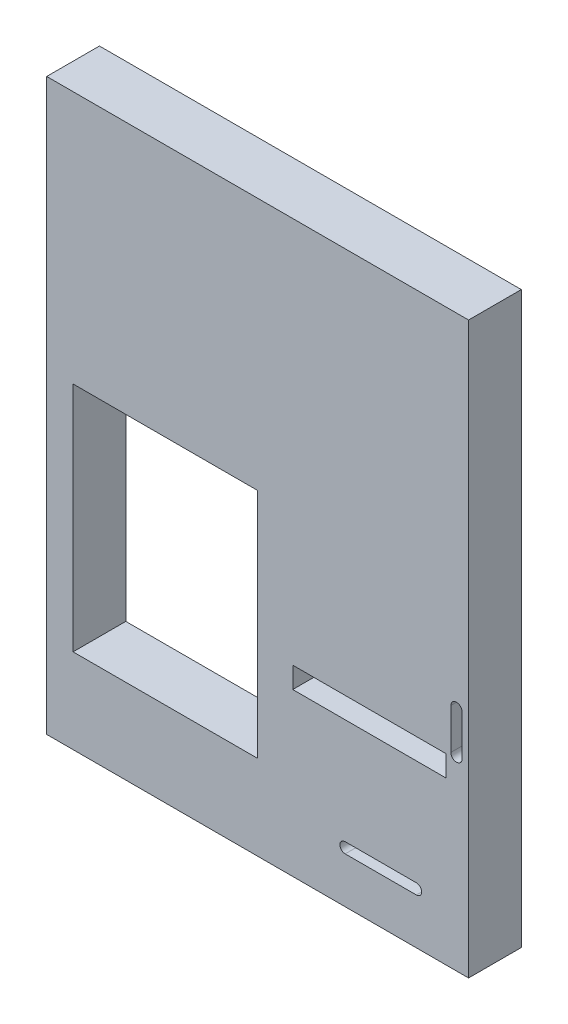
ISO-10303-21;
HEADER;
FILE_DESCRIPTION(('STEP AP214'),'2;1');
FILE_NAME('part.step','',(''),(''),'','','');
FILE_SCHEMA(('AUTOMOTIVE_DESIGN { 1 0 10303 214 1 1 1 1 }'));
ENDSEC;
DATA;
#1=APPLICATION_CONTEXT('core data for automotive mechanical design processes');
#2=APPLICATION_PROTOCOL_DEFINITION('international standard','automotive_design',2000,#1);
#3=PRODUCT_CONTEXT('',#1,'mechanical');
#4=PRODUCT('Part','Part','',(#3));
#5=PRODUCT_RELATED_PRODUCT_CATEGORY('part','',(#4));
#6=PRODUCT_DEFINITION_FORMATION('','',#4);
#7=PRODUCT_DEFINITION_CONTEXT('part definition',#1,'design');
#8=PRODUCT_DEFINITION('design','',#6,#7);
#9=PRODUCT_DEFINITION_SHAPE('','',#8);
#10=(LENGTH_UNIT() NAMED_UNIT(*) SI_UNIT(.MILLI.,.METRE.));
#11=(NAMED_UNIT(*) PLANE_ANGLE_UNIT() SI_UNIT($,.RADIAN.));
#12=(NAMED_UNIT(*) SI_UNIT($,.STERADIAN.) SOLID_ANGLE_UNIT());
#13=UNCERTAINTY_MEASURE_WITH_UNIT(LENGTH_MEASURE(1.E-05),#10,'distance_accuracy_value','');
#14=(GEOMETRIC_REPRESENTATION_CONTEXT(3) GLOBAL_UNCERTAINTY_ASSIGNED_CONTEXT((#13)) GLOBAL_UNIT_ASSIGNED_CONTEXT((#10,
#11,#12)) REPRESENTATION_CONTEXT('',''));
#15=CARTESIAN_POINT('',(0.,0.,0.));
#16=DIRECTION('',(0.,0.,1.));
#17=DIRECTION('',(1.,0.,0.));
#18=AXIS2_PLACEMENT_3D('',#15,#16,#17);
#19=CARTESIAN_POINT('',(100.,120.,25.));
#20=DIRECTION('',(0.,-1.,0.));
#21=DIRECTION('',(1.,0.,0.));
#22=AXIS2_PLACEMENT_3D('',#19,#20,#21);
#23=PLANE('',#22);
#24=DIRECTION('',(-1.,0.,0.));
#25=VECTOR('',#24,1.);
#26=CARTESIAN_POINT('',(100.,120.,0.));
#27=LINE('',#26,#25);
#28=CARTESIAN_POINT('',(100.,120.,0.));
#29=VERTEX_POINT('',#28);
#30=CARTESIAN_POINT('',(-100.,120.,0.));
#31=VERTEX_POINT('',#30);
#32=EDGE_CURVE('E290',#29,#31,#27,.T.);
#33=ORIENTED_EDGE('',*,*,#32,.T.);
#34=DIRECTION('',(0.,0.,-1.));
#35=VECTOR('',#34,1.);
#36=CARTESIAN_POINT('',(-100.,120.,25.));
#37=LINE('',#36,#35);
#38=CARTESIAN_POINT('',(-100.,120.,25.));
#39=VERTEX_POINT('',#38);
#40=EDGE_CURVE('E12',#39,#31,#37,.T.);
#41=ORIENTED_EDGE('',*,*,#40,.F.);
#42=DIRECTION('',(-1.,0.,0.));
#43=VECTOR('',#42,1.);
#44=CARTESIAN_POINT('',(100.,120.,25.));
#45=LINE('',#44,#43);
#46=CARTESIAN_POINT('',(100.,120.,25.));
#47=VERTEX_POINT('',#46);
#48=EDGE_CURVE('E305',#47,#39,#45,.T.);
#49=ORIENTED_EDGE('',*,*,#48,.F.);
#50=DIRECTION('',(0.,0.,-1.));
#51=VECTOR('',#50,1.);
#52=CARTESIAN_POINT('',(100.,120.,25.));
#53=LINE('',#52,#51);
#54=EDGE_CURVE('E56',#47,#29,#53,.T.);
#55=ORIENTED_EDGE('',*,*,#54,.T.);
#56=EDGE_LOOP('',(#33,#41,#49,#55));
#57=FACE_BOUND('',#56,.T.);
#58=ADVANCED_FACE('F48',(#57),#23,.F.);
#59=CARTESIAN_POINT('',(-100.,-120.,25.));
#60=DIRECTION('',(-1.,0.,0.));
#61=DIRECTION('',(0.,0.,1.));
#62=AXIS2_PLACEMENT_3D('',#59,#60,#61);
#63=PLANE('',#62);
#64=DIRECTION('',(0.,1.,0.));
#65=VECTOR('',#64,1.);
#66=CARTESIAN_POINT('',(-100.,-120.,0.));
#67=LINE('',#66,#65);
#68=CARTESIAN_POINT('',(-100.,-150.164162566349,0.));
#69=VERTEX_POINT('',#68);
#70=EDGE_CURVE('E295',#69,#31,#67,.T.);
#71=ORIENTED_EDGE('',*,*,#70,.F.);
#72=DIRECTION('',(0.,0.,1.));
#73=VECTOR('',#72,1.);
#74=CARTESIAN_POINT('',(-100.,-150.164162566349,0.));
#75=LINE('',#74,#73);
#76=CARTESIAN_POINT('',(-100.,-150.164162566349,25.));
#77=VERTEX_POINT('',#76);
#78=EDGE_CURVE('E271',#69,#77,#75,.T.);
#79=ORIENTED_EDGE('',*,*,#78,.T.);
#80=DIRECTION('',(0.,1.,0.));
#81=VECTOR('',#80,1.);
#82=CARTESIAN_POINT('',(-100.,-120.,25.));
#83=LINE('',#82,#81);
#84=EDGE_CURVE('E313',#77,#39,#83,.T.);
#85=ORIENTED_EDGE('',*,*,#84,.T.);
#86=ORIENTED_EDGE('',*,*,#40,.T.);
#87=EDGE_LOOP('',(#71,#79,#85,#86));
#88=FACE_BOUND('',#87,.T.);
#89=ADVANCED_FACE('F431',(#88),#63,.T.);
#90=CARTESIAN_POINT('',(100.,-120.,25.));
#91=DIRECTION('',(-1.,0.,0.));
#92=DIRECTION('',(0.,0.,1.));
#93=AXIS2_PLACEMENT_3D('',#90,#91,#92);
#94=PLANE('',#93);
#95=DIRECTION('',(0.,1.,0.));
#96=VECTOR('',#95,1.);
#97=CARTESIAN_POINT('',(100.,-120.,0.));
#98=LINE('',#97,#96);
#99=CARTESIAN_POINT('',(100.,-150.164162566349,0.));
#100=VERTEX_POINT('',#99);
#101=EDGE_CURVE('E302',#100,#29,#98,.T.);
#102=ORIENTED_EDGE('',*,*,#101,.T.);
#103=ORIENTED_EDGE('',*,*,#54,.F.);
#104=DIRECTION('',(0.,1.,0.));
#105=VECTOR('',#104,1.);
#106=CARTESIAN_POINT('',(100.,-120.,25.));
#107=LINE('',#106,#105);
#108=CARTESIAN_POINT('',(100.,-150.164162566349,25.));
#109=VERTEX_POINT('',#108);
#110=EDGE_CURVE('E297',#109,#47,#107,.T.);
#111=ORIENTED_EDGE('',*,*,#110,.F.);
#112=DIRECTION('',(0.,0.,1.));
#113=VECTOR('',#112,1.);
#114=CARTESIAN_POINT('',(100.,-150.164162566349,0.));
#115=LINE('',#114,#113);
#116=EDGE_CURVE('E347',#100,#109,#115,.T.);
#117=ORIENTED_EDGE('',*,*,#116,.F.);
#118=EDGE_LOOP('',(#102,#103,#111,#117));
#119=FACE_BOUND('',#118,.T.);
#120=ADVANCED_FACE('F436',(#119),#94,.F.);
#121=CARTESIAN_POINT('',(0.,0.,25.));
#122=DIRECTION('',(0.,0.,-1.));
#123=DIRECTION('',(-1.,0.,0.));
#124=AXIS2_PLACEMENT_3D('',#121,#122,#123);
#125=PLANE('',#124);
#126=DIRECTION('',(1.,0.,0.));
#127=VECTOR('',#126,1.);
#128=CARTESIAN_POINT('',(0.,-63.3939838192922,25.));
#129=LINE('',#128,#127);
#130=CARTESIAN_POINT('',(16.6490819522243,-63.3939838192922,25.));
#131=VERTEX_POINT('',#130);
#132=CARTESIAN_POINT('',(89.3674545266771,-63.3939838192922,25.));
#133=VERTEX_POINT('',#132);
#134=EDGE_CURVE('E504',#131,#133,#129,.T.);
#135=ORIENTED_EDGE('',*,*,#134,.T.);
#136=DIRECTION('',(0.,-1.,0.));
#137=VECTOR('',#136,1.);
#138=CARTESIAN_POINT('',(89.3674545266771,0.,25.));
#139=LINE('',#138,#137);
#140=CARTESIAN_POINT('',(89.3674545266771,-73.3939838192922,25.));
#141=VERTEX_POINT('',#140);
#142=EDGE_CURVE('E230',#133,#141,#139,.T.);
#143=ORIENTED_EDGE('',*,*,#142,.T.);
#144=DIRECTION('',(-1.,0.,0.));
#145=VECTOR('',#144,1.);
#146=CARTESIAN_POINT('',(0.,-73.3939838192922,25.));
#147=LINE('',#146,#145);
#148=CARTESIAN_POINT('',(16.6490819522243,-73.3939838192922,25.));
#149=VERTEX_POINT('',#148);
#150=EDGE_CURVE('E509',#141,#149,#147,.T.);
#151=ORIENTED_EDGE('',*,*,#150,.T.);
#152=DIRECTION('',(0.,1.,0.));
#153=VECTOR('',#152,1.);
#154=CARTESIAN_POINT('',(16.6490819522243,0.,25.));
#155=LINE('',#154,#153);
#156=EDGE_CURVE('E190',#149,#131,#155,.T.);
#157=ORIENTED_EDGE('',*,*,#156,.T.);
#158=EDGE_LOOP('',(#135,#143,#151,#157));
#159=FACE_BOUND('',#158,.T.);
#160=DIRECTION('',(1.,0.,0.));
#161=VECTOR('',#160,1.);
#162=CARTESIAN_POINT('',(0.,-123.445469049431,25.));
#163=LINE('',#162,#161);
#164=CARTESIAN_POINT('',(41.4919387106455,-123.445469049431,25.));
#165=VERTEX_POINT('',#164);
#166=CARTESIAN_POINT('',(75.2670888522956,-123.445469049431,25.));
#167=VERTEX_POINT('',#166);
#168=EDGE_CURVE('E545',#165,#167,#163,.T.);
#169=ORIENTED_EDGE('',*,*,#168,.T.);
#170=CARTESIAN_POINT('',(75.2670888522956,-125.945469049431,25.));
#171=DIRECTION('',(0.,0.,-1.));
#172=DIRECTION('',(-1.,0.,0.));
#173=AXIS2_PLACEMENT_3D('',#170,#171,#172);
#174=CIRCLE('',#173,2.5);
#175=CARTESIAN_POINT('',(75.2670888522956,-128.445469049431,25.));
#176=VERTEX_POINT('',#175);
#177=EDGE_CURVE('E250',#167,#176,#174,.T.);
#178=ORIENTED_EDGE('',*,*,#177,.T.);
#179=DIRECTION('',(-1.,0.,0.));
#180=VECTOR('',#179,1.);
#181=CARTESIAN_POINT('',(0.,-128.445469049431,25.));
#182=LINE('',#181,#180);
#183=CARTESIAN_POINT('',(41.4919387106455,-128.445469049431,25.));
#184=VERTEX_POINT('',#183);
#185=EDGE_CURVE('E537',#176,#184,#182,.T.);
#186=ORIENTED_EDGE('',*,*,#185,.T.);
#187=CARTESIAN_POINT('',(41.4919387106455,-125.945469049431,25.));
#188=DIRECTION('',(0.,0.,-1.));
#189=DIRECTION('',(-1.,0.,0.));
#190=AXIS2_PLACEMENT_3D('',#187,#188,#189);
#191=CIRCLE('',#190,2.5);
#192=EDGE_CURVE('E541',#184,#165,#191,.T.);
#193=ORIENTED_EDGE('',*,*,#192,.T.);
#194=EDGE_LOOP('',(#169,#178,#186,#193));
#195=FACE_BOUND('',#194,.T.);
#196=DIRECTION('',(0.,1.,0.));
#197=VECTOR('',#196,1.);
#198=CARTESIAN_POINT('',(91.5975388869168,0.,25.));
#199=LINE('',#198,#197);
#200=CARTESIAN_POINT('',(91.5975388869168,-61.7491897215178,25.));
#201=VERTEX_POINT('',#200);
#202=CARTESIAN_POINT('',(91.5975388869168,-42.4693194311734,25.));
#203=VERTEX_POINT('',#202);
#204=EDGE_CURVE('E369',#201,#203,#199,.T.);
#205=ORIENTED_EDGE('',*,*,#204,.T.);
#206=CARTESIAN_POINT('',(94.2568313407574,-42.4693194311734,25.));
#207=DIRECTION('',(0.,0.,-1.));
#208=DIRECTION('',(-1.,0.,0.));
#209=AXIS2_PLACEMENT_3D('',#206,#207,#208);
#210=CIRCLE('',#209,2.6592924538406);
#211=CARTESIAN_POINT('',(96.916123794598,-42.4693194311734,25.));
#212=VERTEX_POINT('',#211);
#213=EDGE_CURVE('E362',#203,#212,#210,.T.);
#214=ORIENTED_EDGE('',*,*,#213,.T.);
#215=DIRECTION('',(0.,-1.,0.));
#216=VECTOR('',#215,1.);
#217=CARTESIAN_POINT('',(96.916123794598,0.,25.));
#218=LINE('',#217,#216);
#219=CARTESIAN_POINT('',(96.916123794598,-61.7491897215178,25.));
#220=VERTEX_POINT('',#219);
#221=EDGE_CURVE('E377',#212,#220,#218,.T.);
#222=ORIENTED_EDGE('',*,*,#221,.T.);
#223=CARTESIAN_POINT('',(94.2568313407574,-61.7491897215178,25.));
#224=DIRECTION('',(0.,0.,-1.));
#225=DIRECTION('',(-1.,0.,0.));
#226=AXIS2_PLACEMENT_3D('',#223,#224,#225);
#227=CIRCLE('',#226,2.6592924538406);
#228=EDGE_CURVE('E373',#220,#201,#227,.T.);
#229=ORIENTED_EDGE('',*,*,#228,.T.);
#230=EDGE_LOOP('',(#205,#214,#222,#229));
#231=FACE_BOUND('',#230,.T.);
#232=DIRECTION('',(-1.,0.,0.));
#233=VECTOR('',#232,1.);
#234=CARTESIAN_POINT('',(0.,0.,25.));
#235=LINE('',#234,#233);
#236=CARTESIAN_POINT('',(0.,0.,25.));
#237=VERTEX_POINT('',#236);
#238=CARTESIAN_POINT('',(-87.5,0.,25.));
#239=VERTEX_POINT('',#238);
#240=EDGE_CURVE('E342',#237,#239,#235,.T.);
#241=ORIENTED_EDGE('',*,*,#240,.F.);
#242=DIRECTION('',(0.,1.,0.));
#243=VECTOR('',#242,1.);
#244=CARTESIAN_POINT('',(0.,0.,25.));
#245=LINE('',#244,#243);
#246=CARTESIAN_POINT('',(0.,-110.,25.));
#247=VERTEX_POINT('',#246);
#248=EDGE_CURVE('E345',#247,#237,#245,.T.);
#249=ORIENTED_EDGE('',*,*,#248,.F.);
#250=DIRECTION('',(1.,0.,0.));
#251=VECTOR('',#250,1.);
#252=CARTESIAN_POINT('',(0.,-110.,25.));
#253=LINE('',#252,#251);
#254=CARTESIAN_POINT('',(-87.5,-110.,25.));
#255=VERTEX_POINT('',#254);
#256=EDGE_CURVE('E270',#255,#247,#253,.T.);
#257=ORIENTED_EDGE('',*,*,#256,.F.);
#258=DIRECTION('',(0.,-1.,0.));
#259=VECTOR('',#258,1.);
#260=CARTESIAN_POINT('',(-87.5,0.,25.));
#261=LINE('',#260,#259);
#262=EDGE_CURVE('E338',#239,#255,#261,.T.);
#263=ORIENTED_EDGE('',*,*,#262,.F.);
#264=EDGE_LOOP('',(#241,#249,#257,#263));
#265=FACE_BOUND('',#264,.T.);
#266=ORIENTED_EDGE('',*,*,#48,.T.);
#267=ORIENTED_EDGE('',*,*,#84,.F.);
#268=DIRECTION('',(1.,0.,0.));
#269=VECTOR('',#268,1.);
#270=CARTESIAN_POINT('',(-100.,-150.164162566349,25.));
#271=LINE('',#270,#269);
#272=EDGE_CURVE('E359',#77,#109,#271,.T.);
#273=ORIENTED_EDGE('',*,*,#272,.T.);
#274=ORIENTED_EDGE('',*,*,#110,.T.);
#275=EDGE_LOOP('',(#266,#267,#273,#274));
#276=FACE_BOUND('',#275,.T.);
#277=ADVANCED_FACE('F417',(#159,#195,#231,#265,#276),#125,.F.);
#278=CARTESIAN_POINT('',(0.,0.,0.));
#279=DIRECTION('',(0.,0.,-1.));
#280=DIRECTION('',(-1.,0.,0.));
#281=AXIS2_PLACEMENT_3D('',#278,#279,#280);
#282=PLANE('',#281);
#283=DIRECTION('',(0.,-1.,0.));
#284=VECTOR('',#283,1.);
#285=CARTESIAN_POINT('',(89.3674545266771,-63.3939838192922,0.));
#286=LINE('',#285,#284);
#287=CARTESIAN_POINT('',(89.3674545266771,-63.3939838192922,0.));
#288=VERTEX_POINT('',#287);
#289=CARTESIAN_POINT('',(89.3674545266771,-73.3939838192922,0.));
#290=VERTEX_POINT('',#289);
#291=EDGE_CURVE('E71',#288,#290,#286,.T.);
#292=ORIENTED_EDGE('',*,*,#291,.F.);
#293=DIRECTION('',(1.,0.,0.));
#294=VECTOR('',#293,1.);
#295=CARTESIAN_POINT('',(89.3674545266771,-63.3939838192922,0.));
#296=LINE('',#295,#294);
#297=CARTESIAN_POINT('',(16.6490819522243,-63.3939838192922,0.));
#298=VERTEX_POINT('',#297);
#299=EDGE_CURVE('E205',#298,#288,#296,.T.);
#300=ORIENTED_EDGE('',*,*,#299,.F.);
#301=DIRECTION('',(0.,1.,0.));
#302=VECTOR('',#301,1.);
#303=CARTESIAN_POINT('',(16.6490819522243,-63.3939838192922,0.));
#304=LINE('',#303,#302);
#305=CARTESIAN_POINT('',(16.6490819522243,-73.3939838192922,0.));
#306=VERTEX_POINT('',#305);
#307=EDGE_CURVE('E187',#306,#298,#304,.T.);
#308=ORIENTED_EDGE('',*,*,#307,.F.);
#309=DIRECTION('',(-1.,0.,0.));
#310=VECTOR('',#309,1.);
#311=CARTESIAN_POINT('',(89.3674545266771,-73.3939838192922,0.));
#312=LINE('',#311,#310);
#313=EDGE_CURVE('E197',#290,#306,#312,.T.);
#314=ORIENTED_EDGE('',*,*,#313,.F.);
#315=EDGE_LOOP('',(#292,#300,#308,#314));
#316=FACE_BOUND('',#315,.T.);
#317=CARTESIAN_POINT('',(75.2670888522956,-125.945469049431,0.));
#318=DIRECTION('',(0.,0.,-1.));
#319=DIRECTION('',(-1.,0.,0.));
#320=AXIS2_PLACEMENT_3D('',#317,#318,#319);
#321=CIRCLE('',#320,2.5);
#322=CARTESIAN_POINT('',(75.2670888522956,-123.445469049431,0.));
#323=VERTEX_POINT('',#322);
#324=CARTESIAN_POINT('',(75.2670888522956,-128.445469049431,0.));
#325=VERTEX_POINT('',#324);
#326=EDGE_CURVE('E224',#323,#325,#321,.T.);
#327=ORIENTED_EDGE('',*,*,#326,.F.);
#328=DIRECTION('',(1.,0.,0.));
#329=VECTOR('',#328,1.);
#330=CARTESIAN_POINT('',(75.2670888522956,-123.445469049431,0.));
#331=LINE('',#330,#329);
#332=CARTESIAN_POINT('',(41.4919387106455,-123.445469049431,0.));
#333=VERTEX_POINT('',#332);
#334=EDGE_CURVE('E522',#333,#323,#331,.T.);
#335=ORIENTED_EDGE('',*,*,#334,.F.);
#336=CARTESIAN_POINT('',(41.4919387106455,-125.945469049431,0.));
#337=DIRECTION('',(0.,0.,-1.));
#338=DIRECTION('',(-1.,0.,0.));
#339=AXIS2_PLACEMENT_3D('',#336,#337,#338);
#340=CIRCLE('',#339,2.5);
#341=CARTESIAN_POINT('',(41.4919387106455,-128.445469049431,0.));
#342=VERTEX_POINT('',#341);
#343=EDGE_CURVE('E236',#342,#333,#340,.T.);
#344=ORIENTED_EDGE('',*,*,#343,.F.);
#345=DIRECTION('',(-1.,0.,0.));
#346=VECTOR('',#345,1.);
#347=CARTESIAN_POINT('',(75.2670888522956,-128.445469049431,0.));
#348=LINE('',#347,#346);
#349=EDGE_CURVE('E229',#325,#342,#348,.T.);
#350=ORIENTED_EDGE('',*,*,#349,.F.);
#351=EDGE_LOOP('',(#327,#335,#344,#350));
#352=FACE_BOUND('',#351,.T.);
#353=CARTESIAN_POINT('',(94.2568313407574,-42.4693194311734,0.));
#354=DIRECTION('',(0.,0.,-1.));
#355=DIRECTION('',(-1.,0.,0.));
#356=AXIS2_PLACEMENT_3D('',#353,#354,#355);
#357=CIRCLE('',#356,2.6592924538406);
#358=CARTESIAN_POINT('',(91.5975388869168,-42.4693194311734,0.));
#359=VERTEX_POINT('',#358);
#360=CARTESIAN_POINT('',(96.916123794598,-42.4693194311734,0.));
#361=VERTEX_POINT('',#360);
#362=EDGE_CURVE('E244',#359,#361,#357,.T.);
#363=ORIENTED_EDGE('',*,*,#362,.F.);
#364=DIRECTION('',(0.,1.,0.));
#365=VECTOR('',#364,1.);
#366=CARTESIAN_POINT('',(91.5975388869168,-42.4693194311734,0.));
#367=LINE('',#366,#365);
#368=CARTESIAN_POINT('',(91.5975388869168,-61.7491897215178,0.));
#369=VERTEX_POINT('',#368);
#370=EDGE_CURVE('E387',#369,#359,#367,.T.);
#371=ORIENTED_EDGE('',*,*,#370,.F.);
#372=CARTESIAN_POINT('',(94.2568313407574,-61.7491897215178,0.));
#373=DIRECTION('',(0.,0.,-1.));
#374=DIRECTION('',(-1.,0.,0.));
#375=AXIS2_PLACEMENT_3D('',#372,#373,#374);
#376=CIRCLE('',#375,2.6592924538406);
#377=CARTESIAN_POINT('',(96.916123794598,-61.7491897215178,0.));
#378=VERTEX_POINT('',#377);
#379=EDGE_CURVE('E256',#378,#369,#376,.T.);
#380=ORIENTED_EDGE('',*,*,#379,.F.);
#381=DIRECTION('',(0.,-1.,0.));
#382=VECTOR('',#381,1.);
#383=CARTESIAN_POINT('',(96.916123794598,-42.4693194311734,0.));
#384=LINE('',#383,#382);
#385=EDGE_CURVE('E249',#361,#378,#384,.T.);
#386=ORIENTED_EDGE('',*,*,#385,.F.);
#387=EDGE_LOOP('',(#363,#371,#380,#386));
#388=FACE_BOUND('',#387,.T.);
#389=DIRECTION('',(0.,1.,0.));
#390=VECTOR('',#389,1.);
#391=CARTESIAN_POINT('',(0.,0.,0.));
#392=LINE('',#391,#390);
#393=CARTESIAN_POINT('',(0.,-110.,0.));
#394=VERTEX_POINT('',#393);
#395=CARTESIAN_POINT('',(0.,0.,0.));
#396=VERTEX_POINT('',#395);
#397=EDGE_CURVE('E264',#394,#396,#392,.T.);
#398=ORIENTED_EDGE('',*,*,#397,.T.);
#399=DIRECTION('',(-1.,0.,0.));
#400=VECTOR('',#399,1.);
#401=CARTESIAN_POINT('',(0.,0.,0.));
#402=LINE('',#401,#400);
#403=CARTESIAN_POINT('',(-87.5,0.,0.));
#404=VERTEX_POINT('',#403);
#405=EDGE_CURVE('E269',#396,#404,#402,.T.);
#406=ORIENTED_EDGE('',*,*,#405,.T.);
#407=DIRECTION('',(0.,-1.,0.));
#408=VECTOR('',#407,1.);
#409=CARTESIAN_POINT('',(-87.5,0.,0.));
#410=LINE('',#409,#408);
#411=CARTESIAN_POINT('',(-87.5,-110.,0.));
#412=VERTEX_POINT('',#411);
#413=EDGE_CURVE('E277',#404,#412,#410,.T.);
#414=ORIENTED_EDGE('',*,*,#413,.T.);
#415=DIRECTION('',(1.,0.,0.));
#416=VECTOR('',#415,1.);
#417=CARTESIAN_POINT('',(0.,-110.,0.));
#418=LINE('',#417,#416);
#419=EDGE_CURVE('E282',#412,#394,#418,.T.);
#420=ORIENTED_EDGE('',*,*,#419,.T.);
#421=EDGE_LOOP('',(#398,#406,#414,#420));
#422=FACE_BOUND('',#421,.T.);
#423=ORIENTED_EDGE('',*,*,#32,.F.);
#424=ORIENTED_EDGE('',*,*,#101,.F.);
#425=DIRECTION('',(1.,0.,0.));
#426=VECTOR('',#425,1.);
#427=CARTESIAN_POINT('',(-100.,-150.164162566349,0.));
#428=LINE('',#427,#426);
#429=EDGE_CURVE('E357',#69,#100,#428,.T.);
#430=ORIENTED_EDGE('',*,*,#429,.F.);
#431=ORIENTED_EDGE('',*,*,#70,.T.);
#432=EDGE_LOOP('',(#423,#424,#430,#431));
#433=FACE_BOUND('',#432,.T.);
#434=ADVANCED_FACE('F202',(#316,#352,#388,#422,#433),#282,.T.);
#435=CARTESIAN_POINT('',(0.,0.,0.));
#436=DIRECTION('',(1.,0.,0.));
#437=DIRECTION('',(0.,1.,0.));
#438=AXIS2_PLACEMENT_3D('',#435,#436,#437);
#439=PLANE('',#438);
#440=ORIENTED_EDGE('',*,*,#248,.T.);
#441=DIRECTION('',(0.,0.,1.));
#442=VECTOR('',#441,1.);
#443=CARTESIAN_POINT('',(0.,0.,0.));
#444=LINE('',#443,#442);
#445=EDGE_CURVE('E323',#396,#237,#444,.T.);
#446=ORIENTED_EDGE('',*,*,#445,.F.);
#447=ORIENTED_EDGE('',*,*,#397,.F.);
#448=DIRECTION('',(0.,0.,1.));
#449=VECTOR('',#448,1.);
#450=CARTESIAN_POINT('',(0.,-110.,0.));
#451=LINE('',#450,#449);
#452=EDGE_CURVE('E296',#394,#247,#451,.T.);
#453=ORIENTED_EDGE('',*,*,#452,.T.);
#454=EDGE_LOOP('',(#440,#446,#447,#453));
#455=FACE_BOUND('',#454,.T.);
#456=ADVANCED_FACE('F448',(#455),#439,.F.);
#457=CARTESIAN_POINT('',(0.,-110.,0.));
#458=DIRECTION('',(0.,-1.,0.));
#459=DIRECTION('',(1.,0.,0.));
#460=AXIS2_PLACEMENT_3D('',#457,#458,#459);
#461=PLANE('',#460);
#462=ORIENTED_EDGE('',*,*,#256,.T.);
#463=ORIENTED_EDGE('',*,*,#452,.F.);
#464=ORIENTED_EDGE('',*,*,#419,.F.);
#465=DIRECTION('',(0.,0.,1.));
#466=VECTOR('',#465,1.);
#467=CARTESIAN_POINT('',(-87.5,-110.,0.));
#468=LINE('',#467,#466);
#469=EDGE_CURVE('E330',#412,#255,#468,.T.);
#470=ORIENTED_EDGE('',*,*,#469,.T.);
#471=EDGE_LOOP('',(#462,#463,#464,#470));
#472=FACE_BOUND('',#471,.T.);
#473=ADVANCED_FACE('F457',(#472),#461,.F.);
#474=CARTESIAN_POINT('',(-87.5,0.,0.));
#475=DIRECTION('',(-1.,0.,0.));
#476=DIRECTION('',(0.,-1.,0.));
#477=AXIS2_PLACEMENT_3D('',#474,#475,#476);
#478=PLANE('',#477);
#479=ORIENTED_EDGE('',*,*,#262,.T.);
#480=ORIENTED_EDGE('',*,*,#469,.F.);
#481=ORIENTED_EDGE('',*,*,#413,.F.);
#482=DIRECTION('',(0.,0.,1.));
#483=VECTOR('',#482,1.);
#484=CARTESIAN_POINT('',(-87.5,0.,0.));
#485=LINE('',#484,#483);
#486=EDGE_CURVE('E327',#404,#239,#485,.T.);
#487=ORIENTED_EDGE('',*,*,#486,.T.);
#488=EDGE_LOOP('',(#479,#480,#481,#487));
#489=FACE_BOUND('',#488,.T.);
#490=ADVANCED_FACE('F461',(#489),#478,.F.);
#491=CARTESIAN_POINT('',(0.,0.,0.));
#492=DIRECTION('',(0.,1.,0.));
#493=DIRECTION('',(-1.,0.,0.));
#494=AXIS2_PLACEMENT_3D('',#491,#492,#493);
#495=PLANE('',#494);
#496=ORIENTED_EDGE('',*,*,#240,.T.);
#497=ORIENTED_EDGE('',*,*,#486,.F.);
#498=ORIENTED_EDGE('',*,*,#405,.F.);
#499=ORIENTED_EDGE('',*,*,#445,.T.);
#500=EDGE_LOOP('',(#496,#497,#498,#499));
#501=FACE_BOUND('',#500,.T.);
#502=ADVANCED_FACE('F458',(#501),#495,.F.);
#503=CARTESIAN_POINT('',(-100.,-150.164162566349,0.));
#504=DIRECTION('',(0.,-1.,0.));
#505=DIRECTION('',(0.,0.,-1.));
#506=AXIS2_PLACEMENT_3D('',#503,#504,#505);
#507=PLANE('',#506);
#508=ORIENTED_EDGE('',*,*,#272,.F.);
#509=ORIENTED_EDGE('',*,*,#78,.F.);
#510=ORIENTED_EDGE('',*,*,#429,.T.);
#511=ORIENTED_EDGE('',*,*,#116,.T.);
#512=EDGE_LOOP('',(#508,#509,#510,#511));
#513=FACE_BOUND('',#512,.T.);
#514=ADVANCED_FACE('F427',(#513),#507,.T.);
#515=CARTESIAN_POINT('',(94.2568313407574,-42.4693194311734,40.));
#516=DIRECTION('',(0.,0.,-1.));
#517=DIRECTION('',(-1.,0.,0.));
#518=AXIS2_PLACEMENT_3D('',#515,#516,#517);
#519=CYLINDRICAL_SURFACE('',#518,2.6592924538406);
#520=DIRECTION('',(0.,0.,-1.));
#521=VECTOR('',#520,1.);
#522=CARTESIAN_POINT('',(91.5975388869168,-42.4693194311734,40.));
#523=LINE('',#522,#521);
#524=EDGE_CURVE('E381',#203,#359,#523,.T.);
#525=ORIENTED_EDGE('',*,*,#524,.T.);
#526=ORIENTED_EDGE('',*,*,#362,.T.);
#527=DIRECTION('',(0.,0.,-1.));
#528=VECTOR('',#527,1.);
#529=CARTESIAN_POINT('',(96.916123794598,-42.4693194311734,40.));
#530=LINE('',#529,#528);
#531=EDGE_CURVE('E382',#212,#361,#530,.T.);
#532=ORIENTED_EDGE('',*,*,#531,.F.);
#533=ORIENTED_EDGE('',*,*,#213,.F.);
#534=EDGE_LOOP('',(#525,#526,#532,#533));
#535=FACE_BOUND('',#534,.T.);
#536=ADVANCED_FACE('F413',(#535),#519,.F.);
#537=CARTESIAN_POINT('',(91.5975388869168,-42.4693194311734,40.));
#538=DIRECTION('',(-1.,0.,0.));
#539=DIRECTION('',(0.,0.,1.));
#540=AXIS2_PLACEMENT_3D('',#537,#538,#539);
#541=PLANE('',#540);
#542=DIRECTION('',(0.,0.,-1.));
#543=VECTOR('',#542,1.);
#544=CARTESIAN_POINT('',(91.5975388869168,-61.7491897215178,40.));
#545=LINE('',#544,#543);
#546=EDGE_CURVE('E390',#201,#369,#545,.T.);
#547=ORIENTED_EDGE('',*,*,#546,.T.);
#548=ORIENTED_EDGE('',*,*,#370,.T.);
#549=ORIENTED_EDGE('',*,*,#524,.F.);
#550=ORIENTED_EDGE('',*,*,#204,.F.);
#551=EDGE_LOOP('',(#547,#548,#549,#550));
#552=FACE_BOUND('',#551,.T.);
#553=ADVANCED_FACE('F419',(#552),#541,.F.);
#554=CARTESIAN_POINT('',(94.2568313407574,-61.7491897215178,40.));
#555=DIRECTION('',(0.,0.,-1.));
#556=DIRECTION('',(-1.,0.,0.));
#557=AXIS2_PLACEMENT_3D('',#554,#555,#556);
#558=CYLINDRICAL_SURFACE('',#557,2.6592924538406);
#559=DIRECTION('',(0.,0.,-1.));
#560=VECTOR('',#559,1.);
#561=CARTESIAN_POINT('',(96.916123794598,-61.7491897215178,40.));
#562=LINE('',#561,#560);
#563=EDGE_CURVE('E386',#220,#378,#562,.T.);
#564=ORIENTED_EDGE('',*,*,#563,.T.);
#565=ORIENTED_EDGE('',*,*,#379,.T.);
#566=ORIENTED_EDGE('',*,*,#546,.F.);
#567=ORIENTED_EDGE('',*,*,#228,.F.);
#568=EDGE_LOOP('',(#564,#565,#566,#567));
#569=FACE_BOUND('',#568,.T.);
#570=ADVANCED_FACE('F406',(#569),#558,.F.);
#571=CARTESIAN_POINT('',(96.916123794598,-42.4693194311734,40.));
#572=DIRECTION('',(1.,0.,0.));
#573=DIRECTION('',(0.,0.,-1.));
#574=AXIS2_PLACEMENT_3D('',#571,#572,#573);
#575=PLANE('',#574);
#576=ORIENTED_EDGE('',*,*,#531,.T.);
#577=ORIENTED_EDGE('',*,*,#385,.T.);
#578=ORIENTED_EDGE('',*,*,#563,.F.);
#579=ORIENTED_EDGE('',*,*,#221,.F.);
#580=EDGE_LOOP('',(#576,#577,#578,#579));
#581=FACE_BOUND('',#580,.T.);
#582=ADVANCED_FACE('F415',(#581),#575,.F.);
#583=CARTESIAN_POINT('',(75.2670888522956,-125.945469049431,40.));
#584=DIRECTION('',(0.,0.,-1.));
#585=DIRECTION('',(-1.,0.,0.));
#586=AXIS2_PLACEMENT_3D('',#583,#584,#585);
#587=CYLINDRICAL_SURFACE('',#586,2.5);
#588=DIRECTION('',(0.,0.,-1.));
#589=VECTOR('',#588,1.);
#590=CARTESIAN_POINT('',(75.2670888522956,-123.445469049431,40.));
#591=LINE('',#590,#589);
#592=EDGE_CURVE('E534',#167,#323,#591,.T.);
#593=ORIENTED_EDGE('',*,*,#592,.T.);
#594=ORIENTED_EDGE('',*,*,#326,.T.);
#595=DIRECTION('',(0.,0.,-1.));
#596=VECTOR('',#595,1.);
#597=CARTESIAN_POINT('',(75.2670888522956,-128.445469049431,40.));
#598=LINE('',#597,#596);
#599=EDGE_CURVE('E525',#176,#325,#598,.T.);
#600=ORIENTED_EDGE('',*,*,#599,.F.);
#601=ORIENTED_EDGE('',*,*,#177,.F.);
#602=EDGE_LOOP('',(#593,#594,#600,#601));
#603=FACE_BOUND('',#602,.T.);
#604=ADVANCED_FACE('F472',(#603),#587,.F.);
#605=CARTESIAN_POINT('',(75.2670888522956,-123.445469049431,40.));
#606=DIRECTION('',(0.,1.,0.));
#607=DIRECTION('',(0.,0.,1.));
#608=AXIS2_PLACEMENT_3D('',#605,#606,#607);
#609=PLANE('',#608);
#610=DIRECTION('',(0.,0.,-1.));
#611=VECTOR('',#610,1.);
#612=CARTESIAN_POINT('',(41.4919387106455,-123.445469049431,40.));
#613=LINE('',#612,#611);
#614=EDGE_CURVE('E531',#165,#333,#613,.T.);
#615=ORIENTED_EDGE('',*,*,#614,.T.);
#616=ORIENTED_EDGE('',*,*,#334,.T.);
#617=ORIENTED_EDGE('',*,*,#592,.F.);
#618=ORIENTED_EDGE('',*,*,#168,.F.);
#619=EDGE_LOOP('',(#615,#616,#617,#618));
#620=FACE_BOUND('',#619,.T.);
#621=ADVANCED_FACE('F476',(#620),#609,.F.);
#622=CARTESIAN_POINT('',(41.4919387106455,-125.945469049431,40.));
#623=DIRECTION('',(0.,0.,-1.));
#624=DIRECTION('',(-1.,0.,0.));
#625=AXIS2_PLACEMENT_3D('',#622,#623,#624);
#626=CYLINDRICAL_SURFACE('',#625,2.5);
#627=DIRECTION('',(0.,0.,-1.));
#628=VECTOR('',#627,1.);
#629=CARTESIAN_POINT('',(41.4919387106455,-128.445469049431,40.));
#630=LINE('',#629,#628);
#631=EDGE_CURVE('E528',#184,#342,#630,.T.);
#632=ORIENTED_EDGE('',*,*,#631,.T.);
#633=ORIENTED_EDGE('',*,*,#343,.T.);
#634=ORIENTED_EDGE('',*,*,#614,.F.);
#635=ORIENTED_EDGE('',*,*,#192,.F.);
#636=EDGE_LOOP('',(#632,#633,#634,#635));
#637=FACE_BOUND('',#636,.T.);
#638=ADVANCED_FACE('F481',(#637),#626,.F.);
#639=CARTESIAN_POINT('',(75.2670888522956,-128.445469049431,40.));
#640=DIRECTION('',(0.,-1.,0.));
#641=DIRECTION('',(0.,0.,-1.));
#642=AXIS2_PLACEMENT_3D('',#639,#640,#641);
#643=PLANE('',#642);
#644=ORIENTED_EDGE('',*,*,#599,.T.);
#645=ORIENTED_EDGE('',*,*,#349,.T.);
#646=ORIENTED_EDGE('',*,*,#631,.F.);
#647=ORIENTED_EDGE('',*,*,#185,.F.);
#648=EDGE_LOOP('',(#644,#645,#646,#647));
#649=FACE_BOUND('',#648,.T.);
#650=ADVANCED_FACE('F485',(#649),#643,.F.);
#651=CARTESIAN_POINT('',(89.3674545266771,-63.3939838192922,40.));
#652=DIRECTION('',(1.,0.,0.));
#653=DIRECTION('',(0.,0.,-1.));
#654=AXIS2_PLACEMENT_3D('',#651,#652,#653);
#655=PLANE('',#654);
#656=DIRECTION('',(0.,0.,-1.));
#657=VECTOR('',#656,1.);
#658=CARTESIAN_POINT('',(89.3674545266771,-63.3939838192922,40.));
#659=LINE('',#658,#657);
#660=EDGE_CURVE('E506',#133,#288,#659,.T.);
#661=ORIENTED_EDGE('',*,*,#660,.T.);
#662=ORIENTED_EDGE('',*,*,#291,.T.);
#663=DIRECTION('',(0.,0.,-1.));
#664=VECTOR('',#663,1.);
#665=CARTESIAN_POINT('',(89.3674545266771,-73.3939838192922,40.));
#666=LINE('',#665,#664);
#667=EDGE_CURVE('E194',#141,#290,#666,.T.);
#668=ORIENTED_EDGE('',*,*,#667,.F.);
#669=ORIENTED_EDGE('',*,*,#142,.F.);
#670=EDGE_LOOP('',(#661,#662,#668,#669));
#671=FACE_BOUND('',#670,.T.);
#672=ADVANCED_FACE('F487',(#671),#655,.F.);
#673=CARTESIAN_POINT('',(89.3674545266771,-63.3939838192922,40.));
#674=DIRECTION('',(0.,1.,0.));
#675=DIRECTION('',(0.,0.,1.));
#676=AXIS2_PLACEMENT_3D('',#673,#674,#675);
#677=PLANE('',#676);
#678=DIRECTION('',(0.,0.,-1.));
#679=VECTOR('',#678,1.);
#680=CARTESIAN_POINT('',(16.6490819522243,-63.3939838192922,40.));
#681=LINE('',#680,#679);
#682=EDGE_CURVE('E193',#131,#298,#681,.T.);
#683=ORIENTED_EDGE('',*,*,#682,.T.);
#684=ORIENTED_EDGE('',*,*,#299,.T.);
#685=ORIENTED_EDGE('',*,*,#660,.F.);
#686=ORIENTED_EDGE('',*,*,#134,.F.);
#687=EDGE_LOOP('',(#683,#684,#685,#686));
#688=FACE_BOUND('',#687,.T.);
#689=ADVANCED_FACE('F494',(#688),#677,.F.);
#690=CARTESIAN_POINT('',(16.6490819522243,-63.3939838192922,40.));
#691=DIRECTION('',(-1.,0.,0.));
#692=DIRECTION('',(0.,0.,1.));
#693=AXIS2_PLACEMENT_3D('',#690,#691,#692);
#694=PLANE('',#693);
#695=DIRECTION('',(0.,0.,-1.));
#696=VECTOR('',#695,1.);
#697=CARTESIAN_POINT('',(16.6490819522243,-73.3939838192922,40.));
#698=LINE('',#697,#696);
#699=EDGE_CURVE('E63',#149,#306,#698,.T.);
#700=ORIENTED_EDGE('',*,*,#699,.T.);
#701=ORIENTED_EDGE('',*,*,#307,.T.);
#702=ORIENTED_EDGE('',*,*,#682,.F.);
#703=ORIENTED_EDGE('',*,*,#156,.F.);
#704=EDGE_LOOP('',(#700,#701,#702,#703));
#705=FACE_BOUND('',#704,.T.);
#706=ADVANCED_FACE('F184',(#705),#694,.F.);
#707=CARTESIAN_POINT('',(89.3674545266771,-73.3939838192922,40.));
#708=DIRECTION('',(0.,-1.,0.));
#709=DIRECTION('',(0.,0.,-1.));
#710=AXIS2_PLACEMENT_3D('',#707,#708,#709);
#711=PLANE('',#710);
#712=ORIENTED_EDGE('',*,*,#667,.T.);
#713=ORIENTED_EDGE('',*,*,#313,.T.);
#714=ORIENTED_EDGE('',*,*,#699,.F.);
#715=ORIENTED_EDGE('',*,*,#150,.F.);
#716=EDGE_LOOP('',(#712,#713,#714,#715));
#717=FACE_BOUND('',#716,.T.);
#718=ADVANCED_FACE('F198',(#717),#711,.F.);
#719=CLOSED_SHELL('',(#58,#89,#120,#277,#434,#456,#473,#490,#502,#514,#536,#553,#570,#582,#604,
#621,#638,#650,#672,#689,#706,#718));
#720=MANIFOLD_SOLID_BREP('B2',#719);
#721=ADVANCED_BREP_SHAPE_REPRESENTATION('',(#18,#720),#14);
#722=SHAPE_DEFINITION_REPRESENTATION(#9,#721);
ENDSEC;
END-ISO-10303-21;
